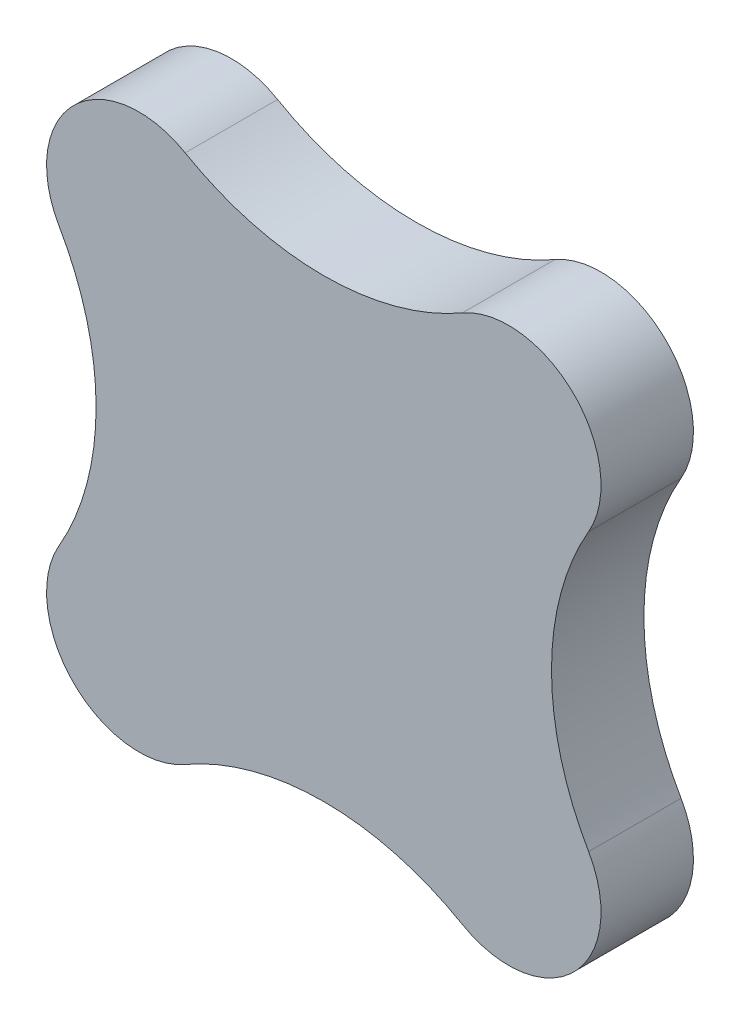
ISO-10303-21;
HEADER;
FILE_DESCRIPTION(('STEP AP214'),'2;1');
FILE_NAME('part.step','',(''),(''),'','','');
FILE_SCHEMA(('AUTOMOTIVE_DESIGN { 1 0 10303 214 1 1 1 1 }'));
ENDSEC;
DATA;
#1=APPLICATION_CONTEXT('core data for automotive mechanical design processes');
#2=APPLICATION_PROTOCOL_DEFINITION('international standard','automotive_design',2000,#1);
#3=PRODUCT_CONTEXT('',#1,'mechanical');
#4=PRODUCT('Part','Part','',(#3));
#5=PRODUCT_RELATED_PRODUCT_CATEGORY('part','',(#4));
#6=PRODUCT_DEFINITION_FORMATION('','',#4);
#7=PRODUCT_DEFINITION_CONTEXT('part definition',#1,'design');
#8=PRODUCT_DEFINITION('design','',#6,#7);
#9=PRODUCT_DEFINITION_SHAPE('','',#8);
#10=(LENGTH_UNIT() NAMED_UNIT(*) SI_UNIT(.MILLI.,.METRE.));
#11=(NAMED_UNIT(*) PLANE_ANGLE_UNIT() SI_UNIT($,.RADIAN.));
#12=(NAMED_UNIT(*) SI_UNIT($,.STERADIAN.) SOLID_ANGLE_UNIT());
#13=UNCERTAINTY_MEASURE_WITH_UNIT(LENGTH_MEASURE(1.E-05),#10,'distance_accuracy_value','');
#14=(GEOMETRIC_REPRESENTATION_CONTEXT(3) GLOBAL_UNCERTAINTY_ASSIGNED_CONTEXT((#13)) GLOBAL_UNIT_ASSIGNED_CONTEXT((#10,
#11,#12)) REPRESENTATION_CONTEXT('',''));
#15=CARTESIAN_POINT('',(0.,0.,0.));
#16=DIRECTION('',(0.,0.,1.));
#17=DIRECTION('',(1.,0.,0.));
#18=AXIS2_PLACEMENT_3D('',#15,#16,#17);
#19=CARTESIAN_POINT('',(-69.3940905122495,0.,-12.7));
#20=DIRECTION('',(0.,0.,1.));
#21=DIRECTION('',(1.,0.,0.));
#22=AXIS2_PLACEMENT_3D('',#19,#20,#21);
#23=CYLINDRICAL_SURFACE('',#22,38.1);
#24=CARTESIAN_POINT('',(-69.3940905122495,0.,0.));
#25=DIRECTION('',(0.,0.,-1.));
#26=DIRECTION('',(-1.,0.,0.));
#27=AXIS2_PLACEMENT_3D('',#24,#25,#26);
#28=CIRCLE('',#27,38.1);
#29=CARTESIAN_POINT('',(-36.3985226280624,19.05,0.));
#30=VERTEX_POINT('',#29);
#31=CARTESIAN_POINT('',(-36.3985226280624,-19.05,0.));
#32=VERTEX_POINT('',#31);
#33=EDGE_CURVE('E130',#30,#32,#28,.T.);
#34=ORIENTED_EDGE('',*,*,#33,.F.);
#35=DIRECTION('',(0.,0.,1.));
#36=VECTOR('',#35,1.);
#37=CARTESIAN_POINT('',(-36.3985226280624,19.05,-12.7));
#38=LINE('',#37,#36);
#39=CARTESIAN_POINT('',(-36.3985226280624,19.05,-12.7));
#40=VERTEX_POINT('',#39);
#41=EDGE_CURVE('E11',#40,#30,#38,.T.);
#42=ORIENTED_EDGE('',*,*,#41,.F.);
#43=CARTESIAN_POINT('',(-69.3940905122495,0.,-12.7));
#44=DIRECTION('',(0.,0.,-1.));
#45=DIRECTION('',(-1.,0.,0.));
#46=AXIS2_PLACEMENT_3D('',#43,#44,#45);
#47=CIRCLE('',#46,38.1);
#48=CARTESIAN_POINT('',(-36.3985226280624,-19.05,-12.7));
#49=VERTEX_POINT('',#48);
#50=EDGE_CURVE('E150',#40,#49,#47,.T.);
#51=ORIENTED_EDGE('',*,*,#50,.T.);
#52=DIRECTION('',(0.,0.,1.));
#53=VECTOR('',#52,1.);
#54=CARTESIAN_POINT('',(-36.3985226280624,-19.05,-12.7));
#55=LINE('',#54,#53);
#56=EDGE_CURVE('E36',#49,#32,#55,.T.);
#57=ORIENTED_EDGE('',*,*,#56,.T.);
#58=EDGE_LOOP('',(#34,#42,#51,#57));
#59=FACE_BOUND('',#58,.T.);
#60=ADVANCED_FACE('F33',(#59),#23,.F.);
#61=CARTESIAN_POINT('',(-25.4,25.4,-12.7));
#62=DIRECTION('',(0.,0.,1.));
#63=DIRECTION('',(1.,0.,0.));
#64=AXIS2_PLACEMENT_3D('',#61,#62,#63);
#65=CYLINDRICAL_SURFACE('',#64,12.7);
#66=CARTESIAN_POINT('',(-25.4,25.4,0.));
#67=DIRECTION('',(0.,0.,1.));
#68=DIRECTION('',(1.,0.,0.));
#69=AXIS2_PLACEMENT_3D('',#66,#67,#68);
#70=CIRCLE('',#69,12.7);
#71=CARTESIAN_POINT('',(-19.05,36.3985226280624,0.));
#72=VERTEX_POINT('',#71);
#73=EDGE_CURVE('E148',#72,#30,#70,.T.);
#74=ORIENTED_EDGE('',*,*,#73,.F.);
#75=DIRECTION('',(0.,0.,1.));
#76=VECTOR('',#75,1.);
#77=CARTESIAN_POINT('',(-19.05,36.3985226280624,-12.7));
#78=LINE('',#77,#76);
#79=CARTESIAN_POINT('',(-19.05,36.3985226280624,-12.7));
#80=VERTEX_POINT('',#79);
#81=EDGE_CURVE('E42',#80,#72,#78,.T.);
#82=ORIENTED_EDGE('',*,*,#81,.F.);
#83=CARTESIAN_POINT('',(-25.4,25.4,-12.7));
#84=DIRECTION('',(0.,0.,1.));
#85=DIRECTION('',(1.,0.,0.));
#86=AXIS2_PLACEMENT_3D('',#83,#84,#85);
#87=CIRCLE('',#86,12.7);
#88=EDGE_CURVE('E120',#80,#40,#87,.T.);
#89=ORIENTED_EDGE('',*,*,#88,.T.);
#90=ORIENTED_EDGE('',*,*,#41,.T.);
#91=EDGE_LOOP('',(#74,#82,#89,#90));
#92=FACE_BOUND('',#91,.T.);
#93=ADVANCED_FACE('F162',(#92),#65,.T.);
#94=CARTESIAN_POINT('',(0.,69.3940905122495,-12.7));
#95=DIRECTION('',(0.,0.,1.));
#96=DIRECTION('',(1.,0.,0.));
#97=AXIS2_PLACEMENT_3D('',#94,#95,#96);
#98=CYLINDRICAL_SURFACE('',#97,38.1);
#99=CARTESIAN_POINT('',(0.,69.3940905122495,0.));
#100=DIRECTION('',(0.,0.,-1.));
#101=DIRECTION('',(1.,0.,0.));
#102=AXIS2_PLACEMENT_3D('',#99,#100,#101);
#103=CIRCLE('',#102,38.1);
#104=CARTESIAN_POINT('',(19.05,36.3985226280624,0.));
#105=VERTEX_POINT('',#104);
#106=EDGE_CURVE('E107',#105,#72,#103,.T.);
#107=ORIENTED_EDGE('',*,*,#106,.F.);
#108=DIRECTION('',(0.,0.,1.));
#109=VECTOR('',#108,1.);
#110=CARTESIAN_POINT('',(19.05,36.3985226280624,-12.7));
#111=LINE('',#110,#109);
#112=CARTESIAN_POINT('',(19.05,36.3985226280624,-12.7));
#113=VERTEX_POINT('',#112);
#114=EDGE_CURVE('E102',#113,#105,#111,.T.);
#115=ORIENTED_EDGE('',*,*,#114,.F.);
#116=CARTESIAN_POINT('',(0.,69.3940905122495,-12.7));
#117=DIRECTION('',(0.,0.,-1.));
#118=DIRECTION('',(1.,0.,0.));
#119=AXIS2_PLACEMENT_3D('',#116,#117,#118);
#120=CIRCLE('',#119,38.1);
#121=EDGE_CURVE('E105',#113,#80,#120,.T.);
#122=ORIENTED_EDGE('',*,*,#121,.T.);
#123=ORIENTED_EDGE('',*,*,#81,.T.);
#124=EDGE_LOOP('',(#107,#115,#122,#123));
#125=FACE_BOUND('',#124,.T.);
#126=ADVANCED_FACE('F104',(#125),#98,.F.);
#127=CARTESIAN_POINT('',(25.4,25.4,-12.7));
#128=DIRECTION('',(0.,0.,1.));
#129=DIRECTION('',(1.,0.,0.));
#130=AXIS2_PLACEMENT_3D('',#127,#128,#129);
#131=CYLINDRICAL_SURFACE('',#130,12.7);
#132=CARTESIAN_POINT('',(25.4,25.4,0.));
#133=DIRECTION('',(0.,0.,1.));
#134=DIRECTION('',(-1.,0.,0.));
#135=AXIS2_PLACEMENT_3D('',#132,#133,#134);
#136=CIRCLE('',#135,12.7);
#137=CARTESIAN_POINT('',(36.3985226280624,19.05,0.));
#138=VERTEX_POINT('',#137);
#139=EDGE_CURVE('E145',#138,#105,#136,.T.);
#140=ORIENTED_EDGE('',*,*,#139,.F.);
#141=DIRECTION('',(0.,0.,1.));
#142=VECTOR('',#141,1.);
#143=CARTESIAN_POINT('',(36.3985226280624,19.05,-12.7));
#144=LINE('',#143,#142);
#145=CARTESIAN_POINT('',(36.3985226280624,19.05,-12.7));
#146=VERTEX_POINT('',#145);
#147=EDGE_CURVE('E112',#146,#138,#144,.T.);
#148=ORIENTED_EDGE('',*,*,#147,.F.);
#149=CARTESIAN_POINT('',(25.4,25.4,-12.7));
#150=DIRECTION('',(0.,0.,1.));
#151=DIRECTION('',(-1.,0.,0.));
#152=AXIS2_PLACEMENT_3D('',#149,#150,#151);
#153=CIRCLE('',#152,12.7);
#154=EDGE_CURVE('E118',#146,#113,#153,.T.);
#155=ORIENTED_EDGE('',*,*,#154,.T.);
#156=ORIENTED_EDGE('',*,*,#114,.T.);
#157=EDGE_LOOP('',(#140,#148,#155,#156));
#158=FACE_BOUND('',#157,.T.);
#159=ADVANCED_FACE('F122',(#158),#131,.T.);
#160=CARTESIAN_POINT('',(69.3940905122495,0.,-12.7));
#161=DIRECTION('',(0.,0.,1.));
#162=DIRECTION('',(1.,0.,0.));
#163=AXIS2_PLACEMENT_3D('',#160,#161,#162);
#164=CYLINDRICAL_SURFACE('',#163,38.1);
#165=CARTESIAN_POINT('',(69.3940905122495,0.,0.));
#166=DIRECTION('',(0.,0.,-1.));
#167=DIRECTION('',(1.,0.,0.));
#168=AXIS2_PLACEMENT_3D('',#165,#166,#167);
#169=CIRCLE('',#168,38.1);
#170=CARTESIAN_POINT('',(36.3985226280624,-19.05,0.));
#171=VERTEX_POINT('',#170);
#172=EDGE_CURVE('E142',#171,#138,#169,.T.);
#173=ORIENTED_EDGE('',*,*,#172,.F.);
#174=DIRECTION('',(0.,0.,1.));
#175=VECTOR('',#174,1.);
#176=CARTESIAN_POINT('',(36.3985226280624,-19.05,-12.7));
#177=LINE('',#176,#175);
#178=CARTESIAN_POINT('',(36.3985226280624,-19.05,-12.7));
#179=VERTEX_POINT('',#178);
#180=EDGE_CURVE('E154',#179,#171,#177,.T.);
#181=ORIENTED_EDGE('',*,*,#180,.F.);
#182=CARTESIAN_POINT('',(69.3940905122495,0.,-12.7));
#183=DIRECTION('',(0.,0.,-1.));
#184=DIRECTION('',(1.,0.,0.));
#185=AXIS2_PLACEMENT_3D('',#182,#183,#184);
#186=CIRCLE('',#185,38.1);
#187=EDGE_CURVE('E123',#179,#146,#186,.T.);
#188=ORIENTED_EDGE('',*,*,#187,.T.);
#189=ORIENTED_EDGE('',*,*,#147,.T.);
#190=EDGE_LOOP('',(#173,#181,#188,#189));
#191=FACE_BOUND('',#190,.T.);
#192=ADVANCED_FACE('F175',(#191),#164,.F.);
#193=CARTESIAN_POINT('',(25.4,-25.4,-12.7));
#194=DIRECTION('',(0.,0.,1.));
#195=DIRECTION('',(1.,0.,0.));
#196=AXIS2_PLACEMENT_3D('',#193,#194,#195);
#197=CYLINDRICAL_SURFACE('',#196,12.7);
#198=CARTESIAN_POINT('',(25.4,-25.4,0.));
#199=DIRECTION('',(0.,0.,1.));
#200=DIRECTION('',(1.,0.,0.));
#201=AXIS2_PLACEMENT_3D('',#198,#199,#200);
#202=CIRCLE('',#201,12.7);
#203=CARTESIAN_POINT('',(19.05,-36.3985226280624,0.));
#204=VERTEX_POINT('',#203);
#205=EDGE_CURVE('E139',#204,#171,#202,.T.);
#206=ORIENTED_EDGE('',*,*,#205,.F.);
#207=DIRECTION('',(0.,0.,1.));
#208=VECTOR('',#207,1.);
#209=CARTESIAN_POINT('',(19.05,-36.3985226280624,-12.7));
#210=LINE('',#209,#208);
#211=CARTESIAN_POINT('',(19.05,-36.3985226280624,-12.7));
#212=VERTEX_POINT('',#211);
#213=EDGE_CURVE('E156',#212,#204,#210,.T.);
#214=ORIENTED_EDGE('',*,*,#213,.F.);
#215=CARTESIAN_POINT('',(25.4,-25.4,-12.7));
#216=DIRECTION('',(0.,0.,1.));
#217=DIRECTION('',(1.,0.,0.));
#218=AXIS2_PLACEMENT_3D('',#215,#216,#217);
#219=CIRCLE('',#218,12.7);
#220=EDGE_CURVE('E125',#212,#179,#219,.T.);
#221=ORIENTED_EDGE('',*,*,#220,.T.);
#222=ORIENTED_EDGE('',*,*,#180,.T.);
#223=EDGE_LOOP('',(#206,#214,#221,#222));
#224=FACE_BOUND('',#223,.T.);
#225=ADVANCED_FACE('F178',(#224),#197,.T.);
#226=CARTESIAN_POINT('',(0.,-69.3940905122495,-12.7));
#227=DIRECTION('',(0.,0.,1.));
#228=DIRECTION('',(1.,0.,0.));
#229=AXIS2_PLACEMENT_3D('',#226,#227,#228);
#230=CYLINDRICAL_SURFACE('',#229,38.1);
#231=CARTESIAN_POINT('',(0.,-69.3940905122495,0.));
#232=DIRECTION('',(0.,0.,-1.));
#233=DIRECTION('',(-1.,0.,0.));
#234=AXIS2_PLACEMENT_3D('',#231,#232,#233);
#235=CIRCLE('',#234,38.1);
#236=CARTESIAN_POINT('',(-19.05,-36.3985226280624,0.));
#237=VERTEX_POINT('',#236);
#238=EDGE_CURVE('E136',#237,#204,#235,.T.);
#239=ORIENTED_EDGE('',*,*,#238,.F.);
#240=DIRECTION('',(0.,0.,1.));
#241=VECTOR('',#240,1.);
#242=CARTESIAN_POINT('',(-19.05,-36.3985226280624,-12.7));
#243=LINE('',#242,#241);
#244=CARTESIAN_POINT('',(-19.05,-36.3985226280624,-12.7));
#245=VERTEX_POINT('',#244);
#246=EDGE_CURVE('E157',#245,#237,#243,.T.);
#247=ORIENTED_EDGE('',*,*,#246,.F.);
#248=CARTESIAN_POINT('',(0.,-69.3940905122495,-12.7));
#249=DIRECTION('',(0.,0.,-1.));
#250=DIRECTION('',(-1.,0.,0.));
#251=AXIS2_PLACEMENT_3D('',#248,#249,#250);
#252=CIRCLE('',#251,38.1);
#253=EDGE_CURVE('E253',#245,#212,#252,.T.);
#254=ORIENTED_EDGE('',*,*,#253,.T.);
#255=ORIENTED_EDGE('',*,*,#213,.T.);
#256=EDGE_LOOP('',(#239,#247,#254,#255));
#257=FACE_BOUND('',#256,.T.);
#258=ADVANCED_FACE('F182',(#257),#230,.F.);
#259=CARTESIAN_POINT('',(-25.4,-25.4,-12.7));
#260=DIRECTION('',(0.,0.,1.));
#261=DIRECTION('',(1.,0.,0.));
#262=AXIS2_PLACEMENT_3D('',#259,#260,#261);
#263=CYLINDRICAL_SURFACE('',#262,12.7);
#264=CARTESIAN_POINT('',(-25.4,-25.4,0.));
#265=DIRECTION('',(0.,0.,1.));
#266=DIRECTION('',(-1.,0.,0.));
#267=AXIS2_PLACEMENT_3D('',#264,#265,#266);
#268=CIRCLE('',#267,12.7);
#269=EDGE_CURVE('E133',#32,#237,#268,.T.);
#270=ORIENTED_EDGE('',*,*,#269,.F.);
#271=ORIENTED_EDGE('',*,*,#56,.F.);
#272=CARTESIAN_POINT('',(-25.4,-25.4,-12.7));
#273=DIRECTION('',(0.,0.,1.));
#274=DIRECTION('',(-1.,0.,0.));
#275=AXIS2_PLACEMENT_3D('',#272,#273,#274);
#276=CIRCLE('',#275,12.7);
#277=EDGE_CURVE('E254',#49,#245,#276,.T.);
#278=ORIENTED_EDGE('',*,*,#277,.T.);
#279=ORIENTED_EDGE('',*,*,#246,.T.);
#280=EDGE_LOOP('',(#270,#271,#278,#279));
#281=FACE_BOUND('',#280,.T.);
#282=ADVANCED_FACE('F159',(#281),#263,.T.);
#283=CARTESIAN_POINT('',(-47.3970452561247,-12.7,-12.7));
#284=DIRECTION('',(0.,0.,-1.));
#285=DIRECTION('',(-1.,0.,0.));
#286=AXIS2_PLACEMENT_3D('',#283,#284,#285);
#287=PLANE('',#286);
#288=ORIENTED_EDGE('',*,*,#50,.F.);
#289=ORIENTED_EDGE('',*,*,#88,.F.);
#290=ORIENTED_EDGE('',*,*,#121,.F.);
#291=ORIENTED_EDGE('',*,*,#154,.F.);
#292=ORIENTED_EDGE('',*,*,#187,.F.);
#293=ORIENTED_EDGE('',*,*,#220,.F.);
#294=ORIENTED_EDGE('',*,*,#253,.F.);
#295=ORIENTED_EDGE('',*,*,#277,.F.);
#296=EDGE_LOOP('',(#288,#289,#290,#291,#292,#293,#294,#295));
#297=FACE_BOUND('',#296,.T.);
#298=ADVANCED_FACE('F116',(#297),#287,.T.);
#299=CARTESIAN_POINT('',(-47.3970452561247,-12.7,0.));
#300=DIRECTION('',(0.,0.,-1.));
#301=DIRECTION('',(-1.,0.,0.));
#302=AXIS2_PLACEMENT_3D('',#299,#300,#301);
#303=PLANE('',#302);
#304=ORIENTED_EDGE('',*,*,#33,.T.);
#305=ORIENTED_EDGE('',*,*,#269,.T.);
#306=ORIENTED_EDGE('',*,*,#238,.T.);
#307=ORIENTED_EDGE('',*,*,#205,.T.);
#308=ORIENTED_EDGE('',*,*,#172,.T.);
#309=ORIENTED_EDGE('',*,*,#139,.T.);
#310=ORIENTED_EDGE('',*,*,#106,.T.);
#311=ORIENTED_EDGE('',*,*,#73,.T.);
#312=EDGE_LOOP('',(#304,#305,#306,#307,#308,#309,#310,#311));
#313=FACE_BOUND('',#312,.T.);
#314=ADVANCED_FACE('F161',(#313),#303,.F.);
#315=CLOSED_SHELL('',(#60,#93,#126,#159,#192,#225,#258,#282,#298,#314));
#316=MANIFOLD_SOLID_BREP('B2',#315);
#317=ADVANCED_BREP_SHAPE_REPRESENTATION('',(#18,#316),#14);
#318=SHAPE_DEFINITION_REPRESENTATION(#9,#317);
ENDSEC;
END-ISO-10303-21;
